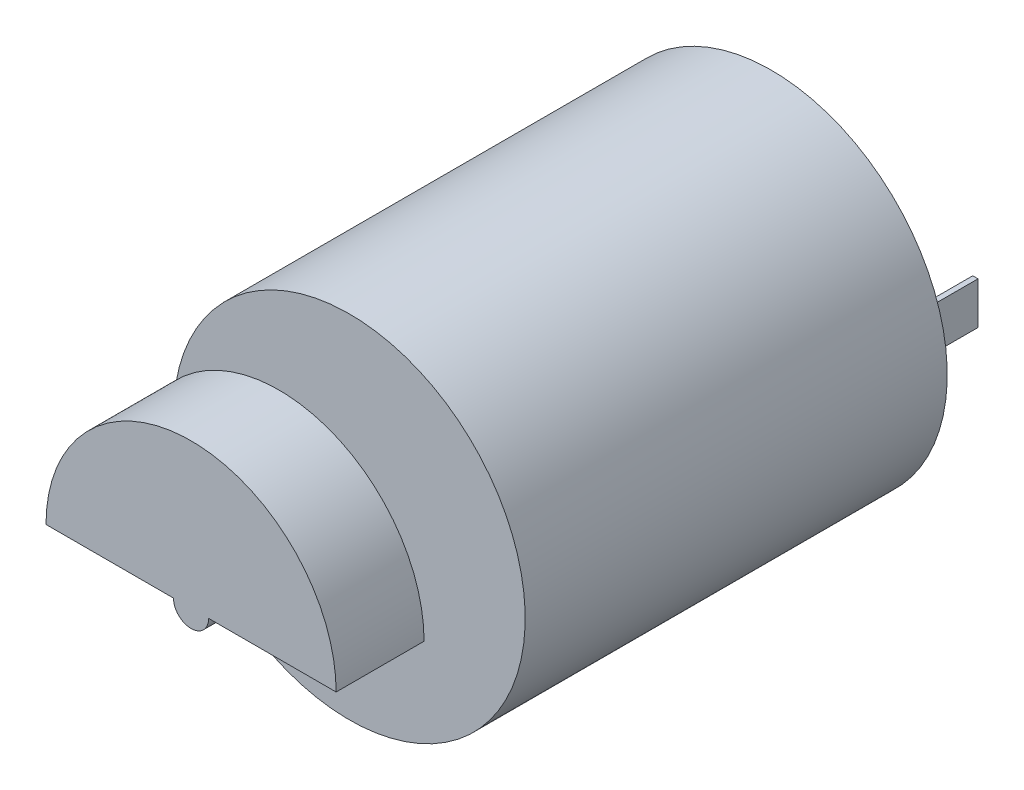
ISO-10303-21;
HEADER;
FILE_DESCRIPTION(('STEP AP214'),'2;1');
FILE_NAME('part.step','',(''),(''),'','','');
FILE_SCHEMA(('AUTOMOTIVE_DESIGN { 1 0 10303 214 1 1 1 1 }'));
ENDSEC;
DATA;
#1=APPLICATION_CONTEXT('core data for automotive mechanical design processes');
#2=APPLICATION_PROTOCOL_DEFINITION('international standard','automotive_design',2000,#1);
#3=PRODUCT_CONTEXT('',#1,'mechanical');
#4=PRODUCT('Part','Part','',(#3));
#5=PRODUCT_RELATED_PRODUCT_CATEGORY('part','',(#4));
#6=PRODUCT_DEFINITION_FORMATION('','',#4);
#7=PRODUCT_DEFINITION_CONTEXT('part definition',#1,'design');
#8=PRODUCT_DEFINITION('design','',#6,#7);
#9=PRODUCT_DEFINITION_SHAPE('','',#8);
#10=(LENGTH_UNIT() NAMED_UNIT(*) SI_UNIT(.MILLI.,.METRE.));
#11=(NAMED_UNIT(*) PLANE_ANGLE_UNIT() SI_UNIT($,.RADIAN.));
#12=(NAMED_UNIT(*) SI_UNIT($,.STERADIAN.) SOLID_ANGLE_UNIT());
#13=UNCERTAINTY_MEASURE_WITH_UNIT(LENGTH_MEASURE(1.E-05),#10,'distance_accuracy_value','');
#14=(GEOMETRIC_REPRESENTATION_CONTEXT(3) GLOBAL_UNCERTAINTY_ASSIGNED_CONTEXT((#13)) GLOBAL_UNIT_ASSIGNED_CONTEXT((#10,
#11,#12)) REPRESENTATION_CONTEXT('',''));
#15=CARTESIAN_POINT('',(0.,0.,0.));
#16=DIRECTION('',(0.,0.,1.));
#17=DIRECTION('',(1.,0.,0.));
#18=AXIS2_PLACEMENT_3D('',#15,#16,#17);
#19=CARTESIAN_POINT('',(0.,0.,-15.24));
#20=DIRECTION('',(0.,0.,1.));
#21=DIRECTION('',(1.,0.,0.));
#22=AXIS2_PLACEMENT_3D('',#19,#20,#21);
#23=PLANE('',#22);
#24=DIRECTION('',(-1.,0.,0.));
#25=VECTOR('',#24,1.);
#26=CARTESIAN_POINT('',(-9.3345,1.524,-15.24));
#27=LINE('',#26,#25);
#28=CARTESIAN_POINT('',(-8.9535,1.524,-15.24));
#29=VERTEX_POINT('',#28);
#30=CARTESIAN_POINT('',(-9.3345,1.524,-15.24));
#31=VERTEX_POINT('',#30);
#32=EDGE_CURVE('E158',#29,#31,#27,.T.);
#33=ORIENTED_EDGE('',*,*,#32,.T.);
#34=DIRECTION('',(0.,-1.,0.));
#35=VECTOR('',#34,1.);
#36=CARTESIAN_POINT('',(-9.3345,1.524,-15.24));
#37=LINE('',#36,#35);
#38=CARTESIAN_POINT('',(-9.3345,-1.524,-15.24));
#39=VERTEX_POINT('',#38);
#40=EDGE_CURVE('E132',#31,#39,#37,.T.);
#41=ORIENTED_EDGE('',*,*,#40,.T.);
#42=DIRECTION('',(1.,0.,0.));
#43=VECTOR('',#42,1.);
#44=CARTESIAN_POINT('',(-9.3345,-1.524,-15.24));
#45=LINE('',#44,#43);
#46=CARTESIAN_POINT('',(-8.9535,-1.524,-15.24));
#47=VERTEX_POINT('',#46);
#48=EDGE_CURVE('E148',#39,#47,#45,.T.);
#49=ORIENTED_EDGE('',*,*,#48,.T.);
#50=DIRECTION('',(0.,1.,0.));
#51=VECTOR('',#50,1.);
#52=CARTESIAN_POINT('',(-8.9535,1.524,-15.24));
#53=LINE('',#52,#51);
#54=EDGE_CURVE('E52',#47,#29,#53,.T.);
#55=ORIENTED_EDGE('',*,*,#54,.T.);
#56=EDGE_LOOP('',(#33,#41,#49,#55));
#57=FACE_BOUND('',#56,.T.);
#58=CARTESIAN_POINT('',(0.,0.,-15.24));
#59=DIRECTION('',(0.,0.,1.));
#60=DIRECTION('',(1.,0.,0.));
#61=AXIS2_PLACEMENT_3D('',#58,#59,#60);
#62=CIRCLE('',#61,12.7);
#63=CARTESIAN_POINT('',(-12.7,0.,-15.24));
#64=VERTEX_POINT('',#63);
#65=EDGE_CURVE('E233',#64,#64,#62,.T.);
#66=ORIENTED_EDGE('',*,*,#65,.F.);
#67=EDGE_LOOP('',(#66));
#68=FACE_BOUND('',#67,.T.);
#69=CARTESIAN_POINT('',(0.,0.,-15.24));
#70=DIRECTION('',(0.,0.,-1.));
#71=DIRECTION('',(-1.,0.,0.));
#72=AXIS2_PLACEMENT_3D('',#69,#70,#71);
#73=CIRCLE('',#72,4.191);
#74=CARTESIAN_POINT('',(-4.191,0.,-15.24));
#75=VERTEX_POINT('',#74);
#76=EDGE_CURVE('E11',#75,#75,#73,.T.);
#77=ORIENTED_EDGE('',*,*,#76,.F.);
#78=EDGE_LOOP('',(#77));
#79=FACE_BOUND('',#78,.T.);
#80=DIRECTION('',(0.,-1.,0.));
#81=VECTOR('',#80,1.);
#82=CARTESIAN_POINT('',(9.3345,1.524,-15.24));
#83=LINE('',#82,#81);
#84=CARTESIAN_POINT('',(9.3345,1.524,-15.24));
#85=VERTEX_POINT('',#84);
#86=CARTESIAN_POINT('',(9.3345,-1.524,-15.24));
#87=VERTEX_POINT('',#86);
#88=EDGE_CURVE('E137',#85,#87,#83,.T.);
#89=ORIENTED_EDGE('',*,*,#88,.F.);
#90=DIRECTION('',(1.,0.,0.));
#91=VECTOR('',#90,1.);
#92=CARTESIAN_POINT('',(9.3345,1.524,-15.24));
#93=LINE('',#92,#91);
#94=CARTESIAN_POINT('',(8.9535,1.524,-15.24));
#95=VERTEX_POINT('',#94);
#96=EDGE_CURVE('E171',#95,#85,#93,.T.);
#97=ORIENTED_EDGE('',*,*,#96,.F.);
#98=DIRECTION('',(0.,1.,0.));
#99=VECTOR('',#98,1.);
#100=CARTESIAN_POINT('',(8.9535,1.524,-15.24));
#101=LINE('',#100,#99);
#102=CARTESIAN_POINT('',(8.9535,-1.524,-15.24));
#103=VERTEX_POINT('',#102);
#104=EDGE_CURVE('E181',#103,#95,#101,.T.);
#105=ORIENTED_EDGE('',*,*,#104,.F.);
#106=DIRECTION('',(-1.,0.,0.));
#107=VECTOR('',#106,1.);
#108=CARTESIAN_POINT('',(9.3345,-1.524,-15.24));
#109=LINE('',#108,#107);
#110=EDGE_CURVE('E60',#87,#103,#109,.T.);
#111=ORIENTED_EDGE('',*,*,#110,.F.);
#112=EDGE_LOOP('',(#89,#97,#105,#111));
#113=FACE_BOUND('',#112,.T.);
#114=ADVANCED_FACE('F36',(#57,#68,#79,#113),#23,.F.);
#115=CARTESIAN_POINT('',(0.,0.,15.24));
#116=DIRECTION('',(0.,0.,-1.));
#117=DIRECTION('',(-1.,0.,0.));
#118=AXIS2_PLACEMENT_3D('',#115,#116,#117);
#119=CYLINDRICAL_SURFACE('',#118,12.7);
#120=CARTESIAN_POINT('',(0.,0.,15.24));
#121=DIRECTION('',(0.,0.,1.));
#122=DIRECTION('',(1.,0.,0.));
#123=AXIS2_PLACEMENT_3D('',#120,#121,#122);
#124=CIRCLE('',#123,12.7);
#125=CARTESIAN_POINT('',(-12.7,0.,15.24));
#126=VERTEX_POINT('',#125);
#127=EDGE_CURVE('E236',#126,#126,#124,.T.);
#128=CARTESIAN_POINT('',(-12.7,0.,15.24));
#129=CARTESIAN_POINT('',(-12.7,0.,14.9225));
#130=CARTESIAN_POINT('',(-12.7,0.,14.605));
#131=CARTESIAN_POINT('',(-12.7,0.,13.97));
#132=CARTESIAN_POINT('',(-12.7,0.,13.6525));
#133=CARTESIAN_POINT('',(-12.7,0.,13.0175));
#134=CARTESIAN_POINT('',(-12.7,0.,12.7));
#135=CARTESIAN_POINT('',(-12.7,0.,12.065));
#136=CARTESIAN_POINT('',(-12.7,0.,11.7475));
#137=CARTESIAN_POINT('',(-12.7,0.,11.1125));
#138=CARTESIAN_POINT('',(-12.7,0.,10.795));
#139=CARTESIAN_POINT('',(-12.7,0.,10.16));
#140=CARTESIAN_POINT('',(-12.7,0.,9.8425));
#141=CARTESIAN_POINT('',(-12.7,0.,9.2075));
#142=CARTESIAN_POINT('',(-12.7,0.,8.89));
#143=CARTESIAN_POINT('',(-12.7,0.,8.255));
#144=CARTESIAN_POINT('',(-12.7,0.,7.9375));
#145=CARTESIAN_POINT('',(-12.7,0.,7.3025));
#146=CARTESIAN_POINT('',(-12.7,0.,6.985));
#147=CARTESIAN_POINT('',(-12.7,0.,6.35));
#148=CARTESIAN_POINT('',(-12.7,0.,6.0325));
#149=CARTESIAN_POINT('',(-12.7,0.,5.3975));
#150=CARTESIAN_POINT('',(-12.7,0.,5.08));
#151=CARTESIAN_POINT('',(-12.7,0.,4.445));
#152=CARTESIAN_POINT('',(-12.7,0.,4.1275));
#153=CARTESIAN_POINT('',(-12.7,0.,3.4925));
#154=CARTESIAN_POINT('',(-12.7,0.,3.175));
#155=CARTESIAN_POINT('',(-12.7,0.,2.54));
#156=CARTESIAN_POINT('',(-12.7,0.,2.2225));
#157=CARTESIAN_POINT('',(-12.7,0.,1.5875));
#158=CARTESIAN_POINT('',(-12.7,0.,1.27));
#159=CARTESIAN_POINT('',(-12.7,0.,0.634999999999998));
#160=CARTESIAN_POINT('',(-12.7,0.,0.317499999999998));
#161=CARTESIAN_POINT('',(-12.7,0.,-0.3175));
#162=CARTESIAN_POINT('',(-12.7,0.,-0.634999999999998));
#163=CARTESIAN_POINT('',(-12.7,0.,-1.27));
#164=CARTESIAN_POINT('',(-12.7,0.,-1.5875));
#165=CARTESIAN_POINT('',(-12.7,0.,-2.2225));
#166=CARTESIAN_POINT('',(-12.7,0.,-2.54));
#167=CARTESIAN_POINT('',(-12.7,0.,-3.175));
#168=CARTESIAN_POINT('',(-12.7,0.,-3.4925));
#169=CARTESIAN_POINT('',(-12.7,0.,-4.1275));
#170=CARTESIAN_POINT('',(-12.7,0.,-4.445));
#171=CARTESIAN_POINT('',(-12.7,0.,-5.08));
#172=CARTESIAN_POINT('',(-12.7,0.,-5.3975));
#173=CARTESIAN_POINT('',(-12.7,0.,-6.0325));
#174=CARTESIAN_POINT('',(-12.7,0.,-6.35));
#175=CARTESIAN_POINT('',(-12.7,0.,-6.985));
#176=CARTESIAN_POINT('',(-12.7,0.,-7.3025));
#177=CARTESIAN_POINT('',(-12.7,0.,-7.9375));
#178=CARTESIAN_POINT('',(-12.7,0.,-8.255));
#179=CARTESIAN_POINT('',(-12.7,0.,-8.89));
#180=CARTESIAN_POINT('',(-12.7,0.,-9.2075));
#181=CARTESIAN_POINT('',(-12.7,0.,-9.8425));
#182=CARTESIAN_POINT('',(-12.7,0.,-10.16));
#183=CARTESIAN_POINT('',(-12.7,0.,-10.795));
#184=CARTESIAN_POINT('',(-12.7,0.,-11.1125));
#185=CARTESIAN_POINT('',(-12.7,0.,-11.7475));
#186=CARTESIAN_POINT('',(-12.7,0.,-12.065));
#187=CARTESIAN_POINT('',(-12.7,0.,-12.7));
#188=CARTESIAN_POINT('',(-12.7,0.,-13.0175));
#189=CARTESIAN_POINT('',(-12.7,0.,-13.6525));
#190=CARTESIAN_POINT('',(-12.7,0.,-13.97));
#191=CARTESIAN_POINT('',(-12.7,0.,-14.605));
#192=CARTESIAN_POINT('',(-12.7,0.,-14.9225));
#193=CARTESIAN_POINT('',(-12.7,0.,-15.24));
#194=B_SPLINE_CURVE_WITH_KNOTS('',3,(#128,#129,#130,#131,#132,#133,#134,#135,#136,#137,#138,
#139,#140,#141,#142,#143,#144,#145,#146,#147,#148,#149,#150,#151,#152,#153,#154,#155,#156,#157,
#158,#159,#160,#161,#162,#163,#164,#165,#166,#167,#168,#169,#170,#171,#172,#173,#174,#175,#176,
#177,#178,#179,#180,#181,#182,#183,#184,#185,#186,#187,#188,#189,#190,#191,#192,#193),
.UNSPECIFIED.,.F.,.F.,(4,2,2,2,2,2,2,2,2,2,2,2,2,2,2,2,2,2,2,2,2,2,2,2,2,2,2,2,2,2,2,2,4),(0.,
0.952499999999998,1.905,2.8575,3.81,4.7625,5.715,6.6675,7.62,8.5725,9.525,10.4775,11.43,12.3825,
13.335,14.2875,15.24,16.1925,17.145,18.0975,19.05,20.0025,20.955,21.9075,22.86,23.8125,24.765,
25.7175,26.67,27.6225,28.575,29.5275,30.48),.UNSPECIFIED.);
#195=EDGE_CURVE('BSEAM38',#126,#64,#194,.T.);
#196=ORIENTED_EDGE('',*,*,#127,.F.);
#197=ORIENTED_EDGE('',*,*,#65,.T.);
#198=ORIENTED_EDGE('',*,*,#195,.T.);
#199=ORIENTED_EDGE('',*,*,#195,.F.);
#200=EDGE_LOOP('',(#196,#198,#197,#199));
#201=FACE_BOUND('',#200,.T.);
#202=ADVANCED_FACE('F38',(#201),#119,.T.);
#203=CARTESIAN_POINT('',(0.,0.,15.24));
#204=DIRECTION('',(0.,0.,1.));
#205=DIRECTION('',(1.,0.,0.));
#206=AXIS2_PLACEMENT_3D('',#203,#204,#205);
#207=PLANE('',#206);
#208=CARTESIAN_POINT('',(0.,0.,15.24));
#209=DIRECTION('',(0.,0.,1.));
#210=DIRECTION('',(1.,0.,0.));
#211=AXIS2_PLACEMENT_3D('',#208,#209,#210);
#212=CIRCLE('',#211,3.048);
#213=CARTESIAN_POINT('',(3.048,0.,15.24));
#214=VERTEX_POINT('',#213);
#215=EDGE_CURVE('E230',#214,#214,#212,.T.);
#216=ORIENTED_EDGE('',*,*,#215,.F.);
#217=EDGE_LOOP('',(#216));
#218=FACE_BOUND('',#217,.T.);
#219=ORIENTED_EDGE('',*,*,#127,.T.);
#220=EDGE_LOOP('',(#219));
#221=FACE_BOUND('',#220,.T.);
#222=ADVANCED_FACE('F309',(#218,#221),#207,.T.);
#223=CARTESIAN_POINT('',(0.,0.,16.51));
#224=DIRECTION('',(0.,0.,-1.));
#225=DIRECTION('',(-1.,0.,0.));
#226=AXIS2_PLACEMENT_3D('',#223,#224,#225);
#227=CYLINDRICAL_SURFACE('',#226,3.048);
#228=CARTESIAN_POINT('',(0.,0.,16.51));
#229=DIRECTION('',(0.,0.,1.));
#230=DIRECTION('',(1.,0.,0.));
#231=AXIS2_PLACEMENT_3D('',#228,#229,#230);
#232=CIRCLE('',#231,3.048);
#233=CARTESIAN_POINT('',(3.048,0.,16.51));
#234=VERTEX_POINT('',#233);
#235=EDGE_CURVE('E226',#234,#234,#232,.T.);
#236=ORIENTED_EDGE('',*,*,#235,.F.);
#237=EDGE_LOOP('',(#236));
#238=FACE_BOUND('',#237,.T.);
#239=ORIENTED_EDGE('',*,*,#215,.T.);
#240=EDGE_LOOP('',(#239));
#241=FACE_BOUND('',#240,.T.);
#242=ADVANCED_FACE('F305',(#238,#241),#227,.T.);
#243=CARTESIAN_POINT('',(0.,0.,16.51));
#244=DIRECTION('',(0.,0.,1.));
#245=DIRECTION('',(1.,0.,0.));
#246=AXIS2_PLACEMENT_3D('',#243,#244,#245);
#247=PLANE('',#246);
#248=CARTESIAN_POINT('',(0.,0.,16.51));
#249=DIRECTION('',(0.,0.,1.));
#250=DIRECTION('',(1.,0.,0.));
#251=AXIS2_PLACEMENT_3D('',#248,#249,#250);
#252=CIRCLE('',#251,1.27);
#253=CARTESIAN_POINT('',(1.27,0.,16.51));
#254=VERTEX_POINT('',#253);
#255=EDGE_CURVE('E227',#254,#254,#252,.T.);
#256=ORIENTED_EDGE('',*,*,#255,.F.);
#257=EDGE_LOOP('',(#256));
#258=FACE_BOUND('',#257,.T.);
#259=ORIENTED_EDGE('',*,*,#235,.T.);
#260=EDGE_LOOP('',(#259));
#261=FACE_BOUND('',#260,.T.);
#262=ADVANCED_FACE('F301',(#258,#261),#247,.T.);
#263=CARTESIAN_POINT('',(0.,0.,26.67));
#264=DIRECTION('',(0.,0.,-1.));
#265=DIRECTION('',(-1.,0.,0.));
#266=AXIS2_PLACEMENT_3D('',#263,#264,#265);
#267=CYLINDRICAL_SURFACE('',#266,1.27);
#268=CARTESIAN_POINT('',(0.,0.,26.67));
#269=DIRECTION('',(0.,0.,1.));
#270=DIRECTION('',(1.,0.,0.));
#271=AXIS2_PLACEMENT_3D('',#268,#269,#270);
#272=CIRCLE('',#271,1.27);
#273=CARTESIAN_POINT('',(-1.27,0.,26.67));
#274=VERTEX_POINT('',#273);
#275=CARTESIAN_POINT('',(1.27,0.,26.67));
#276=VERTEX_POINT('',#275);
#277=EDGE_CURVE('E223',#274,#276,#272,.T.);
#278=ORIENTED_EDGE('',*,*,#277,.F.);
#279=DIRECTION('',(0.,0.,-1.));
#280=VECTOR('',#279,1.);
#281=CARTESIAN_POINT('',(-1.27,0.,26.67));
#282=LINE('',#281,#280);
#283=CARTESIAN_POINT('',(-1.27,0.,20.32));
#284=VERTEX_POINT('',#283);
#285=EDGE_CURVE('E220',#274,#284,#282,.T.);
#286=ORIENTED_EDGE('',*,*,#285,.T.);
#287=CARTESIAN_POINT('',(0.,0.,20.32));
#288=DIRECTION('',(0.,0.,-1.));
#289=DIRECTION('',(-1.,0.,0.));
#290=AXIS2_PLACEMENT_3D('',#287,#288,#289);
#291=CIRCLE('',#290,1.27);
#292=CARTESIAN_POINT('',(1.27,0.,20.32));
#293=VERTEX_POINT('',#292);
#294=EDGE_CURVE('E40',#284,#293,#291,.T.);
#295=ORIENTED_EDGE('',*,*,#294,.T.);
#296=DIRECTION('',(0.,0.,-1.));
#297=VECTOR('',#296,1.);
#298=CARTESIAN_POINT('',(1.27,0.,26.67));
#299=LINE('',#298,#297);
#300=EDGE_CURVE('E216',#293,#276,#299,.F.);
#301=ORIENTED_EDGE('',*,*,#300,.T.);
#302=EDGE_LOOP('',(#278,#286,#295,#301));
#303=FACE_BOUND('',#302,.T.);
#304=ORIENTED_EDGE('',*,*,#255,.T.);
#305=EDGE_LOOP('',(#304));
#306=FACE_BOUND('',#305,.T.);
#307=ADVANCED_FACE('F297',(#303,#306),#267,.T.);
#308=CARTESIAN_POINT('',(0.,0.,26.67));
#309=DIRECTION('',(0.,0.,1.));
#310=DIRECTION('',(1.,0.,0.));
#311=AXIS2_PLACEMENT_3D('',#308,#309,#310);
#312=PLANE('',#311);
#313=ORIENTED_EDGE('',*,*,#277,.T.);
#314=DIRECTION('',(1.,0.,0.));
#315=VECTOR('',#314,1.);
#316=CARTESIAN_POINT('',(-10.4775,0.,26.67));
#317=LINE('',#316,#315);
#318=CARTESIAN_POINT('',(10.4775,0.,26.67));
#319=VERTEX_POINT('',#318);
#320=EDGE_CURVE('E211',#276,#319,#317,.T.);
#321=ORIENTED_EDGE('',*,*,#320,.T.);
#322=CARTESIAN_POINT('',(0.,0.,26.67));
#323=DIRECTION('',(0.,0.,1.));
#324=DIRECTION('',(-1.,0.,0.));
#325=AXIS2_PLACEMENT_3D('',#322,#323,#324);
#326=CIRCLE('',#325,10.4775);
#327=CARTESIAN_POINT('',(-10.4775,0.,26.67));
#328=VERTEX_POINT('',#327);
#329=EDGE_CURVE('E198',#319,#328,#326,.T.);
#330=ORIENTED_EDGE('',*,*,#329,.T.);
#331=EDGE_CURVE('E204',#328,#274,#317,.T.);
#332=ORIENTED_EDGE('',*,*,#331,.T.);
#333=EDGE_LOOP('',(#313,#321,#330,#332));
#334=FACE_BOUND('',#333,.T.);
#335=ADVANCED_FACE('F290',(#334),#312,.T.);
#336=CARTESIAN_POINT('',(-10.4775,0.,20.32));
#337=DIRECTION('',(0.,-1.,0.));
#338=DIRECTION('',(0.,0.,-1.));
#339=AXIS2_PLACEMENT_3D('',#336,#337,#338);
#340=PLANE('',#339);
#341=ORIENTED_EDGE('',*,*,#285,.F.);
#342=ORIENTED_EDGE('',*,*,#331,.F.);
#343=DIRECTION('',(0.,0.,1.));
#344=VECTOR('',#343,1.);
#345=CARTESIAN_POINT('',(-10.4775,0.,20.32));
#346=LINE('',#345,#344);
#347=CARTESIAN_POINT('',(-10.4775,0.,20.32));
#348=VERTEX_POINT('',#347);
#349=EDGE_CURVE('E208',#348,#328,#346,.T.);
#350=ORIENTED_EDGE('',*,*,#349,.F.);
#351=DIRECTION('',(1.,0.,0.));
#352=VECTOR('',#351,1.);
#353=CARTESIAN_POINT('',(-10.4775,0.,20.32));
#354=LINE('',#353,#352);
#355=EDGE_CURVE('E205',#348,#284,#354,.T.);
#356=ORIENTED_EDGE('',*,*,#355,.T.);
#357=EDGE_LOOP('',(#341,#342,#350,#356));
#358=FACE_BOUND('',#357,.T.);
#359=ADVANCED_FACE('F286',(#358),#340,.T.);
#360=ORIENTED_EDGE('',*,*,#300,.F.);
#361=CARTESIAN_POINT('',(10.4775,0.,20.32));
#362=VERTEX_POINT('',#361);
#363=EDGE_CURVE('E203',#293,#362,#354,.T.);
#364=ORIENTED_EDGE('',*,*,#363,.T.);
#365=DIRECTION('',(0.,0.,1.));
#366=VECTOR('',#365,1.);
#367=CARTESIAN_POINT('',(10.4775,0.,20.32));
#368=LINE('',#367,#366);
#369=EDGE_CURVE('E213',#362,#319,#368,.T.);
#370=ORIENTED_EDGE('',*,*,#369,.T.);
#371=ORIENTED_EDGE('',*,*,#320,.F.);
#372=EDGE_LOOP('',(#360,#364,#370,#371));
#373=FACE_BOUND('',#372,.T.);
#374=ADVANCED_FACE('F289',(#373),#340,.T.);
#375=CARTESIAN_POINT('',(0.,0.,20.32));
#376=DIRECTION('',(0.,0.,1.));
#377=DIRECTION('',(1.,0.,0.));
#378=AXIS2_PLACEMENT_3D('',#375,#376,#377);
#379=CYLINDRICAL_SURFACE('',#378,10.4775);
#380=ORIENTED_EDGE('',*,*,#329,.F.);
#381=ORIENTED_EDGE('',*,*,#369,.F.);
#382=CARTESIAN_POINT('',(0.,0.,20.32));
#383=DIRECTION('',(0.,0.,1.));
#384=DIRECTION('',(-1.,0.,0.));
#385=AXIS2_PLACEMENT_3D('',#382,#383,#384);
#386=CIRCLE('',#385,10.4775);
#387=EDGE_CURVE('E200',#362,#348,#386,.T.);
#388=ORIENTED_EDGE('',*,*,#387,.T.);
#389=ORIENTED_EDGE('',*,*,#349,.T.);
#390=EDGE_LOOP('',(#380,#381,#388,#389));
#391=FACE_BOUND('',#390,.T.);
#392=ADVANCED_FACE('F284',(#391),#379,.T.);
#393=CARTESIAN_POINT('',(0.,0.,20.32));
#394=DIRECTION('',(0.,0.,-1.));
#395=DIRECTION('',(-1.,0.,0.));
#396=AXIS2_PLACEMENT_3D('',#393,#394,#395);
#397=PLANE('',#396);
#398=ORIENTED_EDGE('',*,*,#294,.F.);
#399=ORIENTED_EDGE('',*,*,#355,.F.);
#400=ORIENTED_EDGE('',*,*,#387,.F.);
#401=ORIENTED_EDGE('',*,*,#363,.F.);
#402=EDGE_LOOP('',(#398,#399,#400,#401));
#403=FACE_BOUND('',#402,.T.);
#404=ADVANCED_FACE('F280',(#403),#397,.T.);
#405=CARTESIAN_POINT('',(0.,0.,-17.272));
#406=DIRECTION('',(0.,0.,1.));
#407=DIRECTION('',(1.,0.,0.));
#408=AXIS2_PLACEMENT_3D('',#405,#406,#407);
#409=CYLINDRICAL_SURFACE('',#408,4.191);
#410=CARTESIAN_POINT('',(0.,0.,-17.272));
#411=DIRECTION('',(0.,0.,-1.));
#412=DIRECTION('',(-1.,0.,0.));
#413=AXIS2_PLACEMENT_3D('',#410,#411,#412);
#414=CIRCLE('',#413,4.191);
#415=CARTESIAN_POINT('',(-4.191,0.,-17.272));
#416=VERTEX_POINT('',#415);
#417=EDGE_CURVE('E196',#416,#416,#414,.T.);
#418=ORIENTED_EDGE('',*,*,#417,.F.);
#419=EDGE_LOOP('',(#418));
#420=FACE_BOUND('',#419,.T.);
#421=ORIENTED_EDGE('',*,*,#76,.T.);
#422=EDGE_LOOP('',(#421));
#423=FACE_BOUND('',#422,.T.);
#424=ADVANCED_FACE('F276',(#420,#423),#409,.T.);
#425=CARTESIAN_POINT('',(0.,0.,-17.272));
#426=DIRECTION('',(0.,0.,-1.));
#427=DIRECTION('',(-1.,0.,0.));
#428=AXIS2_PLACEMENT_3D('',#425,#426,#427);
#429=PLANE('',#428);
#430=ORIENTED_EDGE('',*,*,#417,.T.);
#431=EDGE_LOOP('',(#430));
#432=FACE_BOUND('',#431,.T.);
#433=ADVANCED_FACE('F270',(#432),#429,.T.);
#434=CARTESIAN_POINT('',(9.3345,1.524,-20.828));
#435=DIRECTION('',(-1.,0.,0.));
#436=DIRECTION('',(0.,0.,1.));
#437=AXIS2_PLACEMENT_3D('',#434,#435,#436);
#438=PLANE('',#437);
#439=ORIENTED_EDGE('',*,*,#88,.T.);
#440=DIRECTION('',(0.,0.,1.));
#441=VECTOR('',#440,1.);
#442=CARTESIAN_POINT('',(9.3345,-1.524,-20.828));
#443=LINE('',#442,#441);
#444=CARTESIAN_POINT('',(9.3345,-1.524,-20.828));
#445=VERTEX_POINT('',#444);
#446=EDGE_CURVE('E194',#445,#87,#443,.T.);
#447=ORIENTED_EDGE('',*,*,#446,.F.);
#448=DIRECTION('',(0.,-1.,0.));
#449=VECTOR('',#448,1.);
#450=CARTESIAN_POINT('',(9.3345,1.524,-20.828));
#451=LINE('',#450,#449);
#452=CARTESIAN_POINT('',(9.3345,1.524,-20.828));
#453=VERTEX_POINT('',#452);
#454=EDGE_CURVE('E167',#453,#445,#451,.T.);
#455=ORIENTED_EDGE('',*,*,#454,.F.);
#456=DIRECTION('',(0.,0.,1.));
#457=VECTOR('',#456,1.);
#458=CARTESIAN_POINT('',(9.3345,1.524,-20.828));
#459=LINE('',#458,#457);
#460=EDGE_CURVE('E177',#453,#85,#459,.T.);
#461=ORIENTED_EDGE('',*,*,#460,.T.);
#462=EDGE_LOOP('',(#439,#447,#455,#461));
#463=FACE_BOUND('',#462,.T.);
#464=ADVANCED_FACE('F254',(#463),#438,.F.);
#465=CARTESIAN_POINT('',(9.3345,-1.524,-20.828));
#466=DIRECTION('',(0.,1.,0.));
#467=DIRECTION('',(0.,0.,1.));
#468=AXIS2_PLACEMENT_3D('',#465,#466,#467);
#469=PLANE('',#468);
#470=ORIENTED_EDGE('',*,*,#110,.T.);
#471=DIRECTION('',(0.,0.,1.));
#472=VECTOR('',#471,1.);
#473=CARTESIAN_POINT('',(8.9535,-1.524,-20.828));
#474=LINE('',#473,#472);
#475=CARTESIAN_POINT('',(8.9535,-1.524,-20.828));
#476=VERTEX_POINT('',#475);
#477=EDGE_CURVE('E191',#476,#103,#474,.T.);
#478=ORIENTED_EDGE('',*,*,#477,.F.);
#479=DIRECTION('',(-1.,0.,0.));
#480=VECTOR('',#479,1.);
#481=CARTESIAN_POINT('',(9.3345,-1.524,-20.828));
#482=LINE('',#481,#480);
#483=EDGE_CURVE('E170',#445,#476,#482,.T.);
#484=ORIENTED_EDGE('',*,*,#483,.F.);
#485=ORIENTED_EDGE('',*,*,#446,.T.);
#486=EDGE_LOOP('',(#470,#478,#484,#485));
#487=FACE_BOUND('',#486,.T.);
#488=ADVANCED_FACE('F262',(#487),#469,.F.);
#489=CARTESIAN_POINT('',(8.9535,1.524,-20.828));
#490=DIRECTION('',(1.,0.,0.));
#491=DIRECTION('',(0.,0.,-1.));
#492=AXIS2_PLACEMENT_3D('',#489,#490,#491);
#493=PLANE('',#492);
#494=ORIENTED_EDGE('',*,*,#104,.T.);
#495=DIRECTION('',(0.,0.,1.));
#496=VECTOR('',#495,1.);
#497=CARTESIAN_POINT('',(8.9535,1.524,-20.828));
#498=LINE('',#497,#496);
#499=CARTESIAN_POINT('',(8.9535,1.524,-20.828));
#500=VERTEX_POINT('',#499);
#501=EDGE_CURVE('E188',#500,#95,#498,.T.);
#502=ORIENTED_EDGE('',*,*,#501,.F.);
#503=DIRECTION('',(0.,1.,0.));
#504=VECTOR('',#503,1.);
#505=CARTESIAN_POINT('',(8.9535,1.524,-20.828));
#506=LINE('',#505,#504);
#507=EDGE_CURVE('E173',#476,#500,#506,.T.);
#508=ORIENTED_EDGE('',*,*,#507,.F.);
#509=ORIENTED_EDGE('',*,*,#477,.T.);
#510=EDGE_LOOP('',(#494,#502,#508,#509));
#511=FACE_BOUND('',#510,.T.);
#512=ADVANCED_FACE('F260',(#511),#493,.F.);
#513=CARTESIAN_POINT('',(9.3345,1.524,-20.828));
#514=DIRECTION('',(0.,-1.,0.));
#515=DIRECTION('',(0.,0.,-1.));
#516=AXIS2_PLACEMENT_3D('',#513,#514,#515);
#517=PLANE('',#516);
#518=ORIENTED_EDGE('',*,*,#96,.T.);
#519=ORIENTED_EDGE('',*,*,#460,.F.);
#520=DIRECTION('',(1.,0.,0.));
#521=VECTOR('',#520,1.);
#522=CARTESIAN_POINT('',(9.3345,1.524,-20.828));
#523=LINE('',#522,#521);
#524=EDGE_CURVE('E175',#500,#453,#523,.T.);
#525=ORIENTED_EDGE('',*,*,#524,.F.);
#526=ORIENTED_EDGE('',*,*,#501,.T.);
#527=EDGE_LOOP('',(#518,#519,#525,#526));
#528=FACE_BOUND('',#527,.T.);
#529=ADVANCED_FACE('F250',(#528),#517,.F.);
#530=CARTESIAN_POINT('',(0.,0.,-20.828));
#531=DIRECTION('',(0.,0.,-1.));
#532=DIRECTION('',(-1.,0.,0.));
#533=AXIS2_PLACEMENT_3D('',#530,#531,#532);
#534=PLANE('',#533);
#535=ORIENTED_EDGE('',*,*,#454,.T.);
#536=ORIENTED_EDGE('',*,*,#483,.T.);
#537=ORIENTED_EDGE('',*,*,#507,.T.);
#538=ORIENTED_EDGE('',*,*,#524,.T.);
#539=EDGE_LOOP('',(#535,#536,#537,#538));
#540=FACE_BOUND('',#539,.T.);
#541=ADVANCED_FACE('F256',(#540),#534,.T.);
#542=CARTESIAN_POINT('',(-9.3345,1.524,-20.828));
#543=DIRECTION('',(-1.,0.,0.));
#544=DIRECTION('',(0.,0.,1.));
#545=AXIS2_PLACEMENT_3D('',#542,#543,#544);
#546=PLANE('',#545);
#547=ORIENTED_EDGE('',*,*,#40,.F.);
#548=DIRECTION('',(0.,0.,1.));
#549=VECTOR('',#548,1.);
#550=CARTESIAN_POINT('',(-9.3345,1.524,-20.828));
#551=LINE('',#550,#549);
#552=CARTESIAN_POINT('',(-9.3345,1.524,-20.828));
#553=VERTEX_POINT('',#552);
#554=EDGE_CURVE('E126',#553,#31,#551,.T.);
#555=ORIENTED_EDGE('',*,*,#554,.F.);
#556=DIRECTION('',(0.,-1.,0.));
#557=VECTOR('',#556,1.);
#558=CARTESIAN_POINT('',(-9.3345,1.524,-20.828));
#559=LINE('',#558,#557);
#560=CARTESIAN_POINT('',(-9.3345,-1.524,-20.828));
#561=VERTEX_POINT('',#560);
#562=EDGE_CURVE('E129',#553,#561,#559,.T.);
#563=ORIENTED_EDGE('',*,*,#562,.T.);
#564=DIRECTION('',(0.,0.,1.));
#565=VECTOR('',#564,1.);
#566=CARTESIAN_POINT('',(-9.3345,-1.524,-20.828));
#567=LINE('',#566,#565);
#568=EDGE_CURVE('E156',#561,#39,#567,.T.);
#569=ORIENTED_EDGE('',*,*,#568,.T.);
#570=EDGE_LOOP('',(#547,#555,#563,#569));
#571=FACE_BOUND('',#570,.T.);
#572=ADVANCED_FACE('F128',(#571),#546,.T.);
#573=CARTESIAN_POINT('',(-9.3345,1.524,-20.828));
#574=DIRECTION('',(0.,1.,0.));
#575=DIRECTION('',(0.,0.,1.));
#576=AXIS2_PLACEMENT_3D('',#573,#574,#575);
#577=PLANE('',#576);
#578=ORIENTED_EDGE('',*,*,#32,.F.);
#579=DIRECTION('',(0.,0.,1.));
#580=VECTOR('',#579,1.);
#581=CARTESIAN_POINT('',(-8.9535,1.524,-20.828));
#582=LINE('',#581,#580);
#583=CARTESIAN_POINT('',(-8.9535,1.524,-20.828));
#584=VERTEX_POINT('',#583);
#585=EDGE_CURVE('E138',#584,#29,#582,.T.);
#586=ORIENTED_EDGE('',*,*,#585,.F.);
#587=DIRECTION('',(-1.,0.,0.));
#588=VECTOR('',#587,1.);
#589=CARTESIAN_POINT('',(-9.3345,1.524,-20.828));
#590=LINE('',#589,#588);
#591=EDGE_CURVE('E144',#584,#553,#590,.T.);
#592=ORIENTED_EDGE('',*,*,#591,.T.);
#593=ORIENTED_EDGE('',*,*,#554,.T.);
#594=EDGE_LOOP('',(#578,#586,#592,#593));
#595=FACE_BOUND('',#594,.T.);
#596=ADVANCED_FACE('F150',(#595),#577,.T.);
#597=CARTESIAN_POINT('',(-8.9535,1.524,-20.828));
#598=DIRECTION('',(1.,0.,0.));
#599=DIRECTION('',(0.,0.,-1.));
#600=AXIS2_PLACEMENT_3D('',#597,#598,#599);
#601=PLANE('',#600);
#602=ORIENTED_EDGE('',*,*,#54,.F.);
#603=DIRECTION('',(0.,0.,1.));
#604=VECTOR('',#603,1.);
#605=CARTESIAN_POINT('',(-8.9535,-1.524,-20.828));
#606=LINE('',#605,#604);
#607=CARTESIAN_POINT('',(-8.9535,-1.524,-20.828));
#608=VERTEX_POINT('',#607);
#609=EDGE_CURVE('E164',#608,#47,#606,.T.);
#610=ORIENTED_EDGE('',*,*,#609,.F.);
#611=DIRECTION('',(0.,1.,0.));
#612=VECTOR('',#611,1.);
#613=CARTESIAN_POINT('',(-8.9535,1.524,-20.828));
#614=LINE('',#613,#612);
#615=EDGE_CURVE('E151',#608,#584,#614,.T.);
#616=ORIENTED_EDGE('',*,*,#615,.T.);
#617=ORIENTED_EDGE('',*,*,#585,.T.);
#618=EDGE_LOOP('',(#602,#610,#616,#617));
#619=FACE_BOUND('',#618,.T.);
#620=ADVANCED_FACE('F351',(#619),#601,.T.);
#621=CARTESIAN_POINT('',(-9.3345,-1.524,-20.828));
#622=DIRECTION('',(0.,-1.,0.));
#623=DIRECTION('',(0.,0.,-1.));
#624=AXIS2_PLACEMENT_3D('',#621,#622,#623);
#625=PLANE('',#624);
#626=ORIENTED_EDGE('',*,*,#48,.F.);
#627=ORIENTED_EDGE('',*,*,#568,.F.);
#628=DIRECTION('',(1.,0.,0.));
#629=VECTOR('',#628,1.);
#630=CARTESIAN_POINT('',(-9.3345,-1.524,-20.828));
#631=LINE('',#630,#629);
#632=EDGE_CURVE('E147',#561,#608,#631,.T.);
#633=ORIENTED_EDGE('',*,*,#632,.T.);
#634=ORIENTED_EDGE('',*,*,#609,.T.);
#635=EDGE_LOOP('',(#626,#627,#633,#634));
#636=FACE_BOUND('',#635,.T.);
#637=ADVANCED_FACE('F360',(#636),#625,.T.);
#638=CARTESIAN_POINT('',(0.,0.,-20.828));
#639=DIRECTION('',(0.,0.,-1.));
#640=DIRECTION('',(1.,0.,0.));
#641=AXIS2_PLACEMENT_3D('',#638,#639,#640);
#642=PLANE('',#641);
#643=ORIENTED_EDGE('',*,*,#562,.F.);
#644=ORIENTED_EDGE('',*,*,#591,.F.);
#645=ORIENTED_EDGE('',*,*,#615,.F.);
#646=ORIENTED_EDGE('',*,*,#632,.F.);
#647=EDGE_LOOP('',(#643,#644,#645,#646));
#648=FACE_BOUND('',#647,.T.);
#649=ADVANCED_FACE('F142',(#648),#642,.T.);
#650=CLOSED_SHELL('',(#114,#202,#222,#242,#262,#307,#335,#359,#374,#392,#404,#424,#433,#464,
#488,#512,#529,#541,#572,#596,#620,#637,#649));
#651=MANIFOLD_SOLID_BREP('B2',#650);
#652=ADVANCED_BREP_SHAPE_REPRESENTATION('',(#18,#651),#14);
#653=SHAPE_DEFINITION_REPRESENTATION(#9,#652);
ENDSEC;
END-ISO-10303-21;
